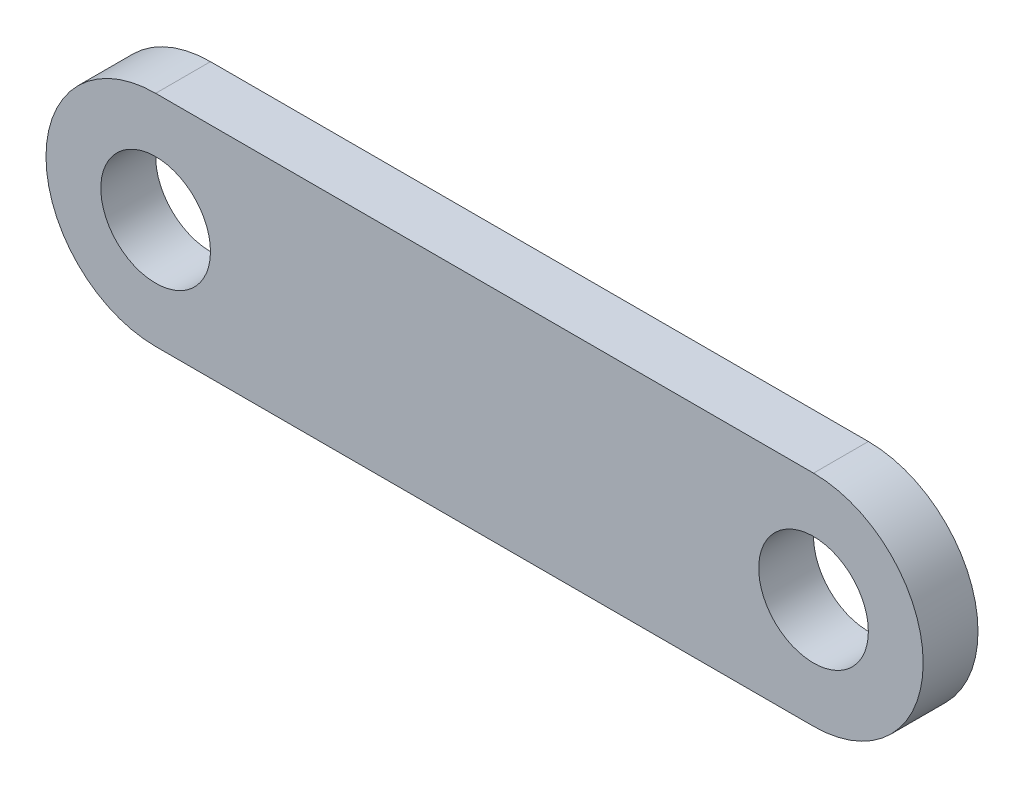
ISO-10303-21;
HEADER;
FILE_DESCRIPTION(('STEP AP214'),'2;1');
FILE_NAME('part.step','',(''),(''),'','','');
FILE_SCHEMA(('AUTOMOTIVE_DESIGN { 1 0 10303 214 1 1 1 1 }'));
ENDSEC;
DATA;
#1=APPLICATION_CONTEXT('core data for automotive mechanical design processes');
#2=APPLICATION_PROTOCOL_DEFINITION('international standard','automotive_design',2000,#1);
#3=PRODUCT_CONTEXT('',#1,'mechanical');
#4=PRODUCT('Part','Part','',(#3));
#5=PRODUCT_RELATED_PRODUCT_CATEGORY('part','',(#4));
#6=PRODUCT_DEFINITION_FORMATION('','',#4);
#7=PRODUCT_DEFINITION_CONTEXT('part definition',#1,'design');
#8=PRODUCT_DEFINITION('design','',#6,#7);
#9=PRODUCT_DEFINITION_SHAPE('','',#8);
#10=(LENGTH_UNIT() NAMED_UNIT(*) SI_UNIT(.MILLI.,.METRE.));
#11=(NAMED_UNIT(*) PLANE_ANGLE_UNIT() SI_UNIT($,.RADIAN.));
#12=(NAMED_UNIT(*) SI_UNIT($,.STERADIAN.) SOLID_ANGLE_UNIT());
#13=UNCERTAINTY_MEASURE_WITH_UNIT(LENGTH_MEASURE(1.E-05),#10,'distance_accuracy_value','');
#14=(GEOMETRIC_REPRESENTATION_CONTEXT(3) GLOBAL_UNCERTAINTY_ASSIGNED_CONTEXT((#13)) GLOBAL_UNIT_ASSIGNED_CONTEXT((#10,
#11,#12)) REPRESENTATION_CONTEXT('',''));
#15=CARTESIAN_POINT('',(0.,0.,0.));
#16=DIRECTION('',(0.,0.,1.));
#17=DIRECTION('',(1.,0.,0.));
#18=AXIS2_PLACEMENT_3D('',#15,#16,#17);
#19=CARTESIAN_POINT('',(-47.2077796721311,10.8728655737705,10.));
#20=DIRECTION('',(0.,0.,1.));
#21=DIRECTION('',(1.,0.,0.));
#22=AXIS2_PLACEMENT_3D('',#19,#20,#21);
#23=PLANE('',#22);
#24=CARTESIAN_POINT('',(72.7922203278689,10.8728655737705,10.));
#25=DIRECTION('',(0.,0.,1.));
#26=DIRECTION('',(1.,0.,0.));
#27=AXIS2_PLACEMENT_3D('',#24,#25,#26);
#28=CIRCLE('',#27,10.);
#29=CARTESIAN_POINT('',(82.7922203278689,10.8728655737705,10.));
#30=VERTEX_POINT('',#29);
#31=EDGE_CURVE('E103',#30,#30,#28,.T.);
#32=ORIENTED_EDGE('',*,*,#31,.F.);
#33=EDGE_LOOP('',(#32));
#34=FACE_BOUND('',#33,.T.);
#35=CARTESIAN_POINT('',(-47.2077796721311,10.8728655737705,10.));
#36=DIRECTION('',(0.,0.,1.));
#37=DIRECTION('',(1.,0.,0.));
#38=AXIS2_PLACEMENT_3D('',#35,#36,#37);
#39=CIRCLE('',#38,20.);
#40=CARTESIAN_POINT('',(-47.2077796721311,30.8728655737705,10.));
#41=VERTEX_POINT('',#40);
#42=CARTESIAN_POINT('',(-47.2077796721311,-9.12713442622952,10.));
#43=VERTEX_POINT('',#42);
#44=EDGE_CURVE('E88',#41,#43,#39,.T.);
#45=ORIENTED_EDGE('',*,*,#44,.T.);
#46=DIRECTION('',(1.,0.,0.));
#47=VECTOR('',#46,1.);
#48=CARTESIAN_POINT('',(-47.2077796721311,-9.12713442622952,10.));
#49=LINE('',#48,#47);
#50=CARTESIAN_POINT('',(72.7922203278689,-9.12713442622952,10.));
#51=VERTEX_POINT('',#50);
#52=EDGE_CURVE('E83',#43,#51,#49,.T.);
#53=ORIENTED_EDGE('',*,*,#52,.T.);
#54=CARTESIAN_POINT('',(72.7922203278689,10.8728655737705,10.));
#55=DIRECTION('',(0.,0.,1.));
#56=DIRECTION('',(1.,0.,0.));
#57=AXIS2_PLACEMENT_3D('',#54,#55,#56);
#58=CIRCLE('',#57,20.);
#59=CARTESIAN_POINT('',(72.7922203278689,30.8728655737705,10.));
#60=VERTEX_POINT('',#59);
#61=EDGE_CURVE('E86',#51,#60,#58,.T.);
#62=ORIENTED_EDGE('',*,*,#61,.T.);
#63=DIRECTION('',(-1.,0.,0.));
#64=VECTOR('',#63,1.);
#65=CARTESIAN_POINT('',(-47.2077796721311,30.8728655737705,10.));
#66=LINE('',#65,#64);
#67=EDGE_CURVE('E53',#60,#41,#66,.T.);
#68=ORIENTED_EDGE('',*,*,#67,.T.);
#69=EDGE_LOOP('',(#45,#53,#62,#68));
#70=FACE_BOUND('',#69,.T.);
#71=CARTESIAN_POINT('',(-47.2077796721311,10.8728655737705,10.));
#72=DIRECTION('',(0.,0.,1.));
#73=DIRECTION('',(1.,0.,0.));
#74=AXIS2_PLACEMENT_3D('',#71,#72,#73);
#75=CIRCLE('',#74,10.);
#76=CARTESIAN_POINT('',(-37.2077796721311,10.8728655737705,10.));
#77=VERTEX_POINT('',#76);
#78=EDGE_CURVE('E118',#77,#77,#75,.T.);
#79=ORIENTED_EDGE('',*,*,#78,.F.);
#80=EDGE_LOOP('',(#79));
#81=FACE_BOUND('',#80,.T.);
#82=ADVANCED_FACE('F36',(#34,#70,#81),#23,.T.);
#83=CARTESIAN_POINT('',(-47.2077796721311,10.8728655737705,0.));
#84=DIRECTION('',(0.,0.,1.));
#85=DIRECTION('',(1.,0.,0.));
#86=AXIS2_PLACEMENT_3D('',#83,#84,#85);
#87=PLANE('',#86);
#88=CARTESIAN_POINT('',(-47.2077796721311,10.8728655737705,0.));
#89=DIRECTION('',(0.,0.,1.));
#90=DIRECTION('',(1.,0.,0.));
#91=AXIS2_PLACEMENT_3D('',#88,#89,#90);
#92=CIRCLE('',#91,20.);
#93=CARTESIAN_POINT('',(-47.2077796721311,30.8728655737705,0.));
#94=VERTEX_POINT('',#93);
#95=CARTESIAN_POINT('',(-47.2077796721311,-9.12713442622952,0.));
#96=VERTEX_POINT('',#95);
#97=EDGE_CURVE('E100',#94,#96,#92,.T.);
#98=ORIENTED_EDGE('',*,*,#97,.F.);
#99=DIRECTION('',(-1.,0.,0.));
#100=VECTOR('',#99,1.);
#101=CARTESIAN_POINT('',(-47.2077796721311,30.8728655737705,0.));
#102=LINE('',#101,#100);
#103=CARTESIAN_POINT('',(72.7922203278689,30.8728655737705,0.));
#104=VERTEX_POINT('',#103);
#105=EDGE_CURVE('E76',#104,#94,#102,.T.);
#106=ORIENTED_EDGE('',*,*,#105,.F.);
#107=CARTESIAN_POINT('',(72.7922203278689,10.8728655737705,0.));
#108=DIRECTION('',(0.,0.,1.));
#109=DIRECTION('',(1.,0.,0.));
#110=AXIS2_PLACEMENT_3D('',#107,#108,#109);
#111=CIRCLE('',#110,20.);
#112=CARTESIAN_POINT('',(72.7922203278689,-9.12713442622952,0.));
#113=VERTEX_POINT('',#112);
#114=EDGE_CURVE('E70',#113,#104,#111,.T.);
#115=ORIENTED_EDGE('',*,*,#114,.F.);
#116=DIRECTION('',(1.,0.,0.));
#117=VECTOR('',#116,1.);
#118=CARTESIAN_POINT('',(-47.2077796721311,-9.12713442622952,0.));
#119=LINE('',#118,#117);
#120=EDGE_CURVE('E92',#96,#113,#119,.T.);
#121=ORIENTED_EDGE('',*,*,#120,.F.);
#122=EDGE_LOOP('',(#98,#106,#115,#121));
#123=FACE_BOUND('',#122,.T.);
#124=CARTESIAN_POINT('',(72.7922203278689,10.8728655737705,0.));
#125=DIRECTION('',(0.,0.,1.));
#126=DIRECTION('',(1.,0.,0.));
#127=AXIS2_PLACEMENT_3D('',#124,#125,#126);
#128=CIRCLE('',#127,10.);
#129=CARTESIAN_POINT('',(82.7922203278689,10.8728655737705,0.));
#130=VERTEX_POINT('',#129);
#131=EDGE_CURVE('E115',#130,#130,#128,.T.);
#132=ORIENTED_EDGE('',*,*,#131,.T.);
#133=EDGE_LOOP('',(#132));
#134=FACE_BOUND('',#133,.T.);
#135=CARTESIAN_POINT('',(-47.2077796721311,10.8728655737705,0.));
#136=DIRECTION('',(0.,0.,1.));
#137=DIRECTION('',(1.,0.,0.));
#138=AXIS2_PLACEMENT_3D('',#135,#136,#137);
#139=CIRCLE('',#138,10.);
#140=CARTESIAN_POINT('',(-37.2077796721311,10.8728655737705,0.));
#141=VERTEX_POINT('',#140);
#142=EDGE_CURVE('E121',#141,#141,#139,.T.);
#143=ORIENTED_EDGE('',*,*,#142,.T.);
#144=EDGE_LOOP('',(#143));
#145=FACE_BOUND('',#144,.T.);
#146=ADVANCED_FACE('F111',(#123,#134,#145),#87,.F.);
#147=CARTESIAN_POINT('',(-47.2077796721311,10.8728655737705,10.));
#148=DIRECTION('',(0.,0.,-1.));
#149=DIRECTION('',(-1.,0.,0.));
#150=AXIS2_PLACEMENT_3D('',#147,#148,#149);
#151=CYLINDRICAL_SURFACE('',#150,20.);
#152=ORIENTED_EDGE('',*,*,#97,.T.);
#153=DIRECTION('',(0.,0.,-1.));
#154=VECTOR('',#153,1.);
#155=CARTESIAN_POINT('',(-47.2077796721311,-9.12713442622952,10.));
#156=LINE('',#155,#154);
#157=EDGE_CURVE('E11',#43,#96,#156,.T.);
#158=ORIENTED_EDGE('',*,*,#157,.F.);
#159=ORIENTED_EDGE('',*,*,#44,.F.);
#160=DIRECTION('',(0.,0.,-1.));
#161=VECTOR('',#160,1.);
#162=CARTESIAN_POINT('',(-47.2077796721311,30.8728655737705,10.));
#163=LINE('',#162,#161);
#164=EDGE_CURVE('E96',#41,#94,#163,.T.);
#165=ORIENTED_EDGE('',*,*,#164,.T.);
#166=EDGE_LOOP('',(#152,#158,#159,#165));
#167=FACE_BOUND('',#166,.T.);
#168=ADVANCED_FACE('F38',(#167),#151,.T.);
#169=CARTESIAN_POINT('',(-47.2077796721311,-9.12713442622952,10.));
#170=DIRECTION('',(0.,1.,0.));
#171=DIRECTION('',(0.,0.,1.));
#172=AXIS2_PLACEMENT_3D('',#169,#170,#171);
#173=PLANE('',#172);
#174=ORIENTED_EDGE('',*,*,#120,.T.);
#175=DIRECTION('',(0.,0.,-1.));
#176=VECTOR('',#175,1.);
#177=CARTESIAN_POINT('',(72.7922203278689,-9.12713442622952,10.));
#178=LINE('',#177,#176);
#179=EDGE_CURVE('E45',#51,#113,#178,.T.);
#180=ORIENTED_EDGE('',*,*,#179,.F.);
#181=ORIENTED_EDGE('',*,*,#52,.F.);
#182=ORIENTED_EDGE('',*,*,#157,.T.);
#183=EDGE_LOOP('',(#174,#180,#181,#182));
#184=FACE_BOUND('',#183,.T.);
#185=ADVANCED_FACE('F91',(#184),#173,.F.);
#186=CARTESIAN_POINT('',(72.7922203278689,10.8728655737705,10.));
#187=DIRECTION('',(0.,0.,-1.));
#188=DIRECTION('',(-1.,0.,0.));
#189=AXIS2_PLACEMENT_3D('',#186,#187,#188);
#190=CYLINDRICAL_SURFACE('',#189,20.);
#191=ORIENTED_EDGE('',*,*,#114,.T.);
#192=DIRECTION('',(0.,0.,-1.));
#193=VECTOR('',#192,1.);
#194=CARTESIAN_POINT('',(72.7922203278689,30.8728655737705,10.));
#195=LINE('',#194,#193);
#196=EDGE_CURVE('E93',#60,#104,#195,.T.);
#197=ORIENTED_EDGE('',*,*,#196,.F.);
#198=ORIENTED_EDGE('',*,*,#61,.F.);
#199=ORIENTED_EDGE('',*,*,#179,.T.);
#200=EDGE_LOOP('',(#191,#197,#198,#199));
#201=FACE_BOUND('',#200,.T.);
#202=ADVANCED_FACE('F94',(#201),#190,.T.);
#203=CARTESIAN_POINT('',(-47.2077796721311,30.8728655737705,10.));
#204=DIRECTION('',(0.,-1.,0.));
#205=DIRECTION('',(0.,0.,-1.));
#206=AXIS2_PLACEMENT_3D('',#203,#204,#205);
#207=PLANE('',#206);
#208=ORIENTED_EDGE('',*,*,#105,.T.);
#209=ORIENTED_EDGE('',*,*,#164,.F.);
#210=ORIENTED_EDGE('',*,*,#67,.F.);
#211=ORIENTED_EDGE('',*,*,#196,.T.);
#212=EDGE_LOOP('',(#208,#209,#210,#211));
#213=FACE_BOUND('',#212,.T.);
#214=ADVANCED_FACE('F108',(#213),#207,.F.);
#215=CARTESIAN_POINT('',(72.7922203278689,10.8728655737705,10.));
#216=DIRECTION('',(0.,0.,-1.));
#217=DIRECTION('',(-1.,0.,0.));
#218=AXIS2_PLACEMENT_3D('',#215,#216,#217);
#219=CYLINDRICAL_SURFACE('',#218,10.);
#220=ORIENTED_EDGE('',*,*,#31,.T.);
#221=EDGE_LOOP('',(#220));
#222=FACE_BOUND('',#221,.T.);
#223=ORIENTED_EDGE('',*,*,#131,.F.);
#224=EDGE_LOOP('',(#223));
#225=FACE_BOUND('',#224,.T.);
#226=ADVANCED_FACE('F138',(#222,#225),#219,.F.);
#227=CARTESIAN_POINT('',(-47.2077796721311,10.8728655737705,10.));
#228=DIRECTION('',(0.,0.,-1.));
#229=DIRECTION('',(-1.,0.,0.));
#230=AXIS2_PLACEMENT_3D('',#227,#228,#229);
#231=CYLINDRICAL_SURFACE('',#230,10.);
#232=ORIENTED_EDGE('',*,*,#78,.T.);
#233=EDGE_LOOP('',(#232));
#234=FACE_BOUND('',#233,.T.);
#235=ORIENTED_EDGE('',*,*,#142,.F.);
#236=EDGE_LOOP('',(#235));
#237=FACE_BOUND('',#236,.T.);
#238=ADVANCED_FACE('F127',(#234,#237),#231,.F.);
#239=CLOSED_SHELL('',(#82,#146,#168,#185,#202,#214,#226,#238));
#240=MANIFOLD_SOLID_BREP('B2',#239);
#241=ADVANCED_BREP_SHAPE_REPRESENTATION('',(#18,#240),#14);
#242=SHAPE_DEFINITION_REPRESENTATION(#9,#241);
ENDSEC;
END-ISO-10303-21;
